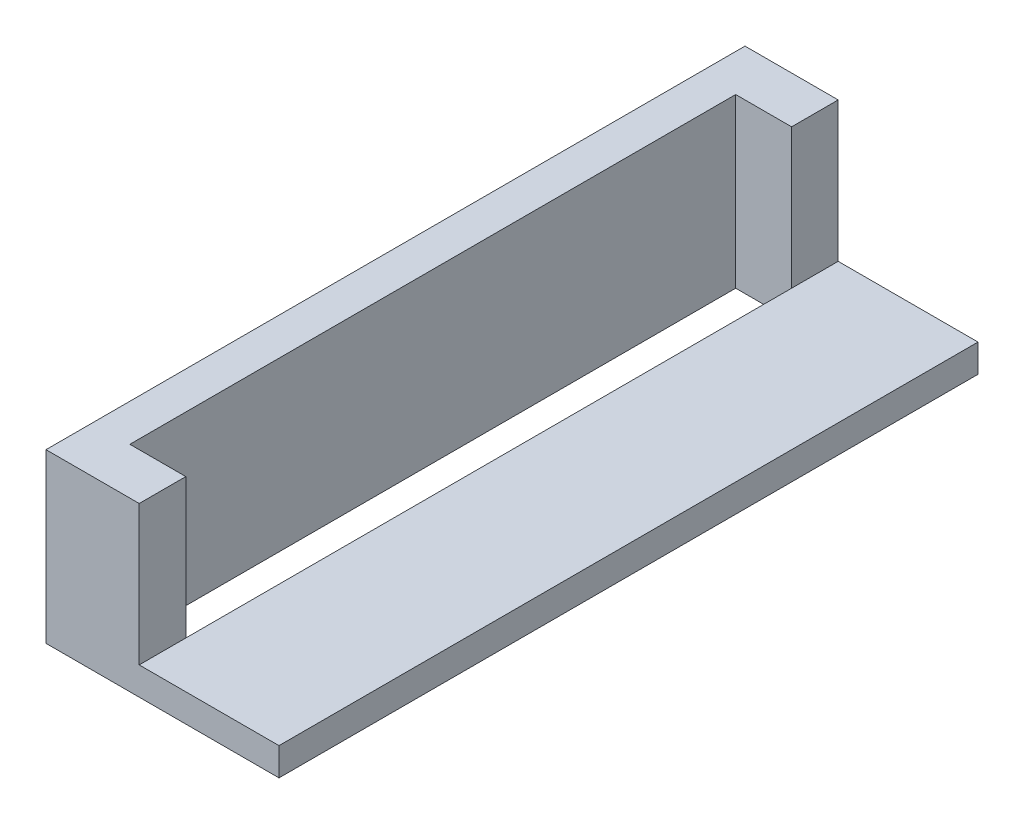
ISO-10303-21;
HEADER;
FILE_DESCRIPTION(('STEP AP214'),'2;1');
FILE_NAME('part.step','',(''),(''),'','','');
FILE_SCHEMA(('AUTOMOTIVE_DESIGN { 1 0 10303 214 1 1 1 1 }'));
ENDSEC;
DATA;
#1=APPLICATION_CONTEXT('core data for automotive mechanical design processes');
#2=APPLICATION_PROTOCOL_DEFINITION('international standard','automotive_design',2000,#1);
#3=PRODUCT_CONTEXT('',#1,'mechanical');
#4=PRODUCT('Part','Part','',(#3));
#5=PRODUCT_RELATED_PRODUCT_CATEGORY('part','',(#4));
#6=PRODUCT_DEFINITION_FORMATION('','',#4);
#7=PRODUCT_DEFINITION_CONTEXT('part definition',#1,'design');
#8=PRODUCT_DEFINITION('design','',#6,#7);
#9=PRODUCT_DEFINITION_SHAPE('','',#8);
#10=(LENGTH_UNIT() NAMED_UNIT(*) SI_UNIT(.MILLI.,.METRE.));
#11=(NAMED_UNIT(*) PLANE_ANGLE_UNIT() SI_UNIT($,.RADIAN.));
#12=(NAMED_UNIT(*) SI_UNIT($,.STERADIAN.) SOLID_ANGLE_UNIT());
#13=UNCERTAINTY_MEASURE_WITH_UNIT(LENGTH_MEASURE(1.E-05),#10,'distance_accuracy_value','');
#14=(GEOMETRIC_REPRESENTATION_CONTEXT(3) GLOBAL_UNCERTAINTY_ASSIGNED_CONTEXT((#13)) GLOBAL_UNIT_ASSIGNED_CONTEXT((#10,
#11,#12)) REPRESENTATION_CONTEXT('',''));
#15=CARTESIAN_POINT('',(0.,0.,0.));
#16=DIRECTION('',(0.,0.,1.));
#17=DIRECTION('',(1.,0.,0.));
#18=AXIS2_PLACEMENT_3D('',#15,#16,#17);
#19=CARTESIAN_POINT('',(-3.,0.6,-15.));
#20=DIRECTION('',(-1.,0.,0.));
#21=DIRECTION('',(0.,0.,1.));
#22=AXIS2_PLACEMENT_3D('',#19,#20,#21);
#23=PLANE('',#22);
#24=DIRECTION('',(0.,0.,1.));
#25=VECTOR('',#24,1.);
#26=CARTESIAN_POINT('',(-3.,0.6,-15.));
#27=LINE('',#26,#25);
#28=CARTESIAN_POINT('',(-3.,0.6,-1.));
#29=VERTEX_POINT('',#28);
#30=CARTESIAN_POINT('',(-3.,0.6,0.));
#31=VERTEX_POINT('',#30);
#32=EDGE_CURVE('E159',#29,#31,#27,.T.);
#33=ORIENTED_EDGE('',*,*,#32,.F.);
#34=DIRECTION('',(0.,1.,0.));
#35=VECTOR('',#34,1.);
#36=CARTESIAN_POINT('',(-3.,0.,-1.));
#37=LINE('',#36,#35);
#38=CARTESIAN_POINT('',(-3.,3.6,-1.));
#39=VERTEX_POINT('',#38);
#40=EDGE_CURVE('E149',#29,#39,#37,.T.);
#41=ORIENTED_EDGE('',*,*,#40,.T.);
#42=DIRECTION('',(0.,0.,1.));
#43=VECTOR('',#42,1.);
#44=CARTESIAN_POINT('',(-3.,3.6,-15.));
#45=LINE('',#44,#43);
#46=CARTESIAN_POINT('',(-3.,3.6,0.));
#47=VERTEX_POINT('',#46);
#48=EDGE_CURVE('E148',#39,#47,#45,.T.);
#49=ORIENTED_EDGE('',*,*,#48,.T.);
#50=DIRECTION('',(0.,1.,0.));
#51=VECTOR('',#50,1.);
#52=CARTESIAN_POINT('',(-3.,0.6,0.));
#53=LINE('',#52,#51);
#54=EDGE_CURVE('E168',#31,#47,#53,.T.);
#55=ORIENTED_EDGE('',*,*,#54,.F.);
#56=EDGE_LOOP('',(#33,#41,#49,#55));
#57=FACE_BOUND('',#56,.T.);
#58=ADVANCED_FACE('F33',(#57),#23,.F.);
#59=CARTESIAN_POINT('',(0.,3.6,0.));
#60=DIRECTION('',(-1.,0.,0.));
#61=DIRECTION('',(0.,0.,1.));
#62=AXIS2_PLACEMENT_3D('',#59,#60,#61);
#63=PLANE('',#62);
#64=DIRECTION('',(0.,-1.,0.));
#65=VECTOR('',#64,1.);
#66=CARTESIAN_POINT('',(0.,3.6,-15.));
#67=LINE('',#66,#65);
#68=CARTESIAN_POINT('',(0.,0.6,-15.));
#69=VERTEX_POINT('',#68);
#70=CARTESIAN_POINT('',(0.,0.,-15.));
#71=VERTEX_POINT('',#70);
#72=EDGE_CURVE('E11',#69,#71,#67,.T.);
#73=ORIENTED_EDGE('',*,*,#72,.F.);
#74=DIRECTION('',(0.,0.,-1.));
#75=VECTOR('',#74,1.);
#76=CARTESIAN_POINT('',(0.,0.6,-15.));
#77=LINE('',#76,#75);
#78=CARTESIAN_POINT('',(0.,0.6,0.));
#79=VERTEX_POINT('',#78);
#80=EDGE_CURVE('E153',#79,#69,#77,.T.);
#81=ORIENTED_EDGE('',*,*,#80,.F.);
#82=DIRECTION('',(0.,-1.,0.));
#83=VECTOR('',#82,1.);
#84=CARTESIAN_POINT('',(0.,3.6,0.));
#85=LINE('',#84,#83);
#86=CARTESIAN_POINT('',(0.,0.,0.));
#87=VERTEX_POINT('',#86);
#88=EDGE_CURVE('E181',#79,#87,#85,.T.);
#89=ORIENTED_EDGE('',*,*,#88,.T.);
#90=DIRECTION('',(0.,0.,-1.));
#91=VECTOR('',#90,1.);
#92=CARTESIAN_POINT('',(0.,0.,0.));
#93=LINE('',#92,#91);
#94=EDGE_CURVE('E171',#87,#71,#93,.T.);
#95=ORIENTED_EDGE('',*,*,#94,.T.);
#96=EDGE_LOOP('',(#73,#81,#89,#95));
#97=FACE_BOUND('',#96,.T.);
#98=ADVANCED_FACE('F35',(#97),#63,.F.);
#99=CARTESIAN_POINT('',(0.,3.6,-15.));
#100=DIRECTION('',(0.,0.,1.));
#101=DIRECTION('',(1.,0.,0.));
#102=AXIS2_PLACEMENT_3D('',#99,#100,#101);
#103=PLANE('',#102);
#104=DIRECTION('',(-1.,0.,0.));
#105=VECTOR('',#104,1.);
#106=CARTESIAN_POINT('',(0.,3.6,-15.));
#107=LINE('',#106,#105);
#108=CARTESIAN_POINT('',(-3.,3.6,-15.));
#109=VERTEX_POINT('',#108);
#110=CARTESIAN_POINT('',(-5.,3.6,-15.));
#111=VERTEX_POINT('',#110);
#112=EDGE_CURVE('E173',#109,#111,#107,.T.);
#113=ORIENTED_EDGE('',*,*,#112,.F.);
#114=DIRECTION('',(0.,1.,0.));
#115=VECTOR('',#114,1.);
#116=CARTESIAN_POINT('',(-3.,0.6,-15.));
#117=LINE('',#116,#115);
#118=CARTESIAN_POINT('',(-3.,0.6,-15.));
#119=VERTEX_POINT('',#118);
#120=EDGE_CURVE('E165',#119,#109,#117,.T.);
#121=ORIENTED_EDGE('',*,*,#120,.F.);
#122=DIRECTION('',(-1.,0.,0.));
#123=VECTOR('',#122,1.);
#124=CARTESIAN_POINT('',(0.,0.6,-15.));
#125=LINE('',#124,#123);
#126=EDGE_CURVE('E155',#69,#119,#125,.T.);
#127=ORIENTED_EDGE('',*,*,#126,.F.);
#128=ORIENTED_EDGE('',*,*,#72,.T.);
#129=DIRECTION('',(-1.,0.,0.));
#130=VECTOR('',#129,1.);
#131=CARTESIAN_POINT('',(0.,0.,-15.));
#132=LINE('',#131,#130);
#133=CARTESIAN_POINT('',(-5.,0.,-15.));
#134=VERTEX_POINT('',#133);
#135=EDGE_CURVE('E184',#71,#134,#132,.T.);
#136=ORIENTED_EDGE('',*,*,#135,.T.);
#137=DIRECTION('',(0.,-1.,0.));
#138=VECTOR('',#137,1.);
#139=CARTESIAN_POINT('',(-5.,3.6,-15.));
#140=LINE('',#139,#138);
#141=EDGE_CURVE('E41',#111,#134,#140,.T.);
#142=ORIENTED_EDGE('',*,*,#141,.F.);
#143=EDGE_LOOP('',(#113,#121,#127,#128,#136,#142));
#144=FACE_BOUND('',#143,.T.);
#145=ADVANCED_FACE('F218',(#144),#103,.F.);
#146=CARTESIAN_POINT('',(-5.,3.6,0.));
#147=DIRECTION('',(1.,0.,0.));
#148=DIRECTION('',(0.,0.,-1.));
#149=AXIS2_PLACEMENT_3D('',#146,#147,#148);
#150=PLANE('',#149);
#151=DIRECTION('',(0.,0.,1.));
#152=VECTOR('',#151,1.);
#153=CARTESIAN_POINT('',(-5.,0.,0.));
#154=LINE('',#153,#152);
#155=CARTESIAN_POINT('',(-5.,0.,0.));
#156=VERTEX_POINT('',#155);
#157=EDGE_CURVE('E186',#134,#156,#154,.T.);
#158=ORIENTED_EDGE('',*,*,#157,.T.);
#159=DIRECTION('',(0.,-1.,0.));
#160=VECTOR('',#159,1.);
#161=CARTESIAN_POINT('',(-5.,3.6,0.));
#162=LINE('',#161,#160);
#163=CARTESIAN_POINT('',(-5.,3.6,0.));
#164=VERTEX_POINT('',#163);
#165=EDGE_CURVE('E191',#164,#156,#162,.T.);
#166=ORIENTED_EDGE('',*,*,#165,.F.);
#167=DIRECTION('',(0.,0.,1.));
#168=VECTOR('',#167,1.);
#169=CARTESIAN_POINT('',(-5.,3.6,0.));
#170=LINE('',#169,#168);
#171=EDGE_CURVE('E175',#111,#164,#170,.T.);
#172=ORIENTED_EDGE('',*,*,#171,.F.);
#173=ORIENTED_EDGE('',*,*,#141,.T.);
#174=EDGE_LOOP('',(#158,#166,#172,#173));
#175=FACE_BOUND('',#174,.T.);
#176=ADVANCED_FACE('F198',(#175),#150,.F.);
#177=CARTESIAN_POINT('',(0.,3.6,0.));
#178=DIRECTION('',(0.,0.,-1.));
#179=DIRECTION('',(-1.,0.,0.));
#180=AXIS2_PLACEMENT_3D('',#177,#178,#179);
#181=PLANE('',#180);
#182=DIRECTION('',(1.,0.,0.));
#183=VECTOR('',#182,1.);
#184=CARTESIAN_POINT('',(0.,0.6,0.));
#185=LINE('',#184,#183);
#186=EDGE_CURVE('E163',#31,#79,#185,.T.);
#187=ORIENTED_EDGE('',*,*,#186,.F.);
#188=ORIENTED_EDGE('',*,*,#54,.T.);
#189=DIRECTION('',(1.,0.,0.));
#190=VECTOR('',#189,1.);
#191=CARTESIAN_POINT('',(0.,3.6,0.));
#192=LINE('',#191,#190);
#193=EDGE_CURVE('E178',#164,#47,#192,.T.);
#194=ORIENTED_EDGE('',*,*,#193,.F.);
#195=ORIENTED_EDGE('',*,*,#165,.T.);
#196=DIRECTION('',(1.,0.,0.));
#197=VECTOR('',#196,1.);
#198=CARTESIAN_POINT('',(0.,0.,0.));
#199=LINE('',#198,#197);
#200=EDGE_CURVE('E176',#156,#87,#199,.T.);
#201=ORIENTED_EDGE('',*,*,#200,.T.);
#202=ORIENTED_EDGE('',*,*,#88,.F.);
#203=EDGE_LOOP('',(#187,#188,#194,#195,#201,#202));
#204=FACE_BOUND('',#203,.T.);
#205=ADVANCED_FACE('F208',(#204),#181,.F.);
#206=CARTESIAN_POINT('',(0.,3.6,0.));
#207=DIRECTION('',(0.,1.,0.));
#208=DIRECTION('',(0.,0.,1.));
#209=AXIS2_PLACEMENT_3D('',#206,#207,#208);
#210=PLANE('',#209);
#211=DIRECTION('',(1.,0.,0.));
#212=VECTOR('',#211,1.);
#213=CARTESIAN_POINT('',(-3.,3.6,-1.));
#214=LINE('',#213,#212);
#215=CARTESIAN_POINT('',(-4.2,3.6,-0.999999999999999));
#216=VERTEX_POINT('',#215);
#217=EDGE_CURVE('E136',#216,#39,#214,.T.);
#218=ORIENTED_EDGE('',*,*,#217,.F.);
#219=DIRECTION('',(0.,0.,1.));
#220=VECTOR('',#219,1.);
#221=CARTESIAN_POINT('',(-4.2,3.6,-14.));
#222=LINE('',#221,#220);
#223=CARTESIAN_POINT('',(-4.2,3.6,-14.));
#224=VERTEX_POINT('',#223);
#225=EDGE_CURVE('E138',#224,#216,#222,.T.);
#226=ORIENTED_EDGE('',*,*,#225,.F.);
#227=DIRECTION('',(-1.,0.,0.));
#228=VECTOR('',#227,1.);
#229=CARTESIAN_POINT('',(-3.,3.6,-14.));
#230=LINE('',#229,#228);
#231=CARTESIAN_POINT('',(-3.,3.6,-14.));
#232=VERTEX_POINT('',#231);
#233=EDGE_CURVE('E143',#232,#224,#230,.T.);
#234=ORIENTED_EDGE('',*,*,#233,.F.);
#235=EDGE_CURVE('E156',#109,#232,#45,.T.);
#236=ORIENTED_EDGE('',*,*,#235,.F.);
#237=ORIENTED_EDGE('',*,*,#112,.T.);
#238=ORIENTED_EDGE('',*,*,#171,.T.);
#239=ORIENTED_EDGE('',*,*,#193,.T.);
#240=ORIENTED_EDGE('',*,*,#48,.F.);
#241=EDGE_LOOP('',(#218,#226,#234,#236,#237,#238,#239,#240));
#242=FACE_BOUND('',#241,.T.);
#243=ADVANCED_FACE('F214',(#242),#210,.T.);
#244=CARTESIAN_POINT('',(0.,0.,0.));
#245=DIRECTION('',(0.,1.,0.));
#246=DIRECTION('',(0.,0.,1.));
#247=AXIS2_PLACEMENT_3D('',#244,#245,#246);
#248=PLANE('',#247);
#249=DIRECTION('',(1.,0.,0.));
#250=VECTOR('',#249,1.);
#251=CARTESIAN_POINT('',(-3.,0.,-1.));
#252=LINE('',#251,#250);
#253=CARTESIAN_POINT('',(-4.2,0.,-0.999999999999999));
#254=VERTEX_POINT('',#253);
#255=CARTESIAN_POINT('',(-3.,0.,-1.));
#256=VERTEX_POINT('',#255);
#257=EDGE_CURVE('E135',#254,#256,#252,.T.);
#258=ORIENTED_EDGE('',*,*,#257,.T.);
#259=DIRECTION('',(0.,0.,-1.));
#260=VECTOR('',#259,1.);
#261=CARTESIAN_POINT('',(-3.,0.,-14.));
#262=LINE('',#261,#260);
#263=CARTESIAN_POINT('',(-3.,0.,-14.));
#264=VERTEX_POINT('',#263);
#265=EDGE_CURVE('E117',#256,#264,#262,.T.);
#266=ORIENTED_EDGE('',*,*,#265,.T.);
#267=DIRECTION('',(-1.,0.,0.));
#268=VECTOR('',#267,1.);
#269=CARTESIAN_POINT('',(-3.,0.,-14.));
#270=LINE('',#269,#268);
#271=CARTESIAN_POINT('',(-4.2,0.,-14.));
#272=VERTEX_POINT('',#271);
#273=EDGE_CURVE('E127',#264,#272,#270,.T.);
#274=ORIENTED_EDGE('',*,*,#273,.T.);
#275=DIRECTION('',(0.,0.,1.));
#276=VECTOR('',#275,1.);
#277=CARTESIAN_POINT('',(-4.2,0.,-14.));
#278=LINE('',#277,#276);
#279=EDGE_CURVE('E48',#272,#254,#278,.T.);
#280=ORIENTED_EDGE('',*,*,#279,.T.);
#281=EDGE_LOOP('',(#258,#266,#274,#280));
#282=FACE_BOUND('',#281,.T.);
#283=ORIENTED_EDGE('',*,*,#94,.F.);
#284=ORIENTED_EDGE('',*,*,#200,.F.);
#285=ORIENTED_EDGE('',*,*,#157,.F.);
#286=ORIENTED_EDGE('',*,*,#135,.F.);
#287=EDGE_LOOP('',(#283,#284,#285,#286));
#288=FACE_BOUND('',#287,.T.);
#289=ADVANCED_FACE('F132',(#282,#288),#248,.F.);
#290=ORIENTED_EDGE('',*,*,#235,.T.);
#291=DIRECTION('',(0.,1.,0.));
#292=VECTOR('',#291,1.);
#293=CARTESIAN_POINT('',(-3.,0.,-14.));
#294=LINE('',#293,#292);
#295=CARTESIAN_POINT('',(-3.,0.6,-14.));
#296=VERTEX_POINT('',#295);
#297=EDGE_CURVE('E124',#296,#232,#294,.T.);
#298=ORIENTED_EDGE('',*,*,#297,.F.);
#299=EDGE_CURVE('E160',#119,#296,#27,.T.);
#300=ORIENTED_EDGE('',*,*,#299,.F.);
#301=ORIENTED_EDGE('',*,*,#120,.T.);
#302=EDGE_LOOP('',(#290,#298,#300,#301));
#303=FACE_BOUND('',#302,.T.);
#304=ADVANCED_FACE('F222',(#303),#23,.F.);
#305=CARTESIAN_POINT('',(0.,0.6,0.));
#306=DIRECTION('',(0.,-1.,0.));
#307=DIRECTION('',(0.,0.,-1.));
#308=AXIS2_PLACEMENT_3D('',#305,#306,#307);
#309=PLANE('',#308);
#310=ORIENTED_EDGE('',*,*,#80,.T.);
#311=ORIENTED_EDGE('',*,*,#126,.T.);
#312=ORIENTED_EDGE('',*,*,#299,.T.);
#313=EDGE_CURVE('E120',#296,#29,#27,.T.);
#314=ORIENTED_EDGE('',*,*,#313,.T.);
#315=ORIENTED_EDGE('',*,*,#32,.T.);
#316=ORIENTED_EDGE('',*,*,#186,.T.);
#317=EDGE_LOOP('',(#310,#311,#312,#314,#315,#316));
#318=FACE_BOUND('',#317,.T.);
#319=ADVANCED_FACE('F224',(#318),#309,.F.);
#320=CARTESIAN_POINT('',(-3.,0.,-14.));
#321=DIRECTION('',(1.,0.,0.));
#322=DIRECTION('',(0.,0.,-1.));
#323=AXIS2_PLACEMENT_3D('',#320,#321,#322);
#324=PLANE('',#323);
#325=EDGE_CURVE('E113',#264,#296,#294,.T.);
#326=ORIENTED_EDGE('',*,*,#325,.F.);
#327=ORIENTED_EDGE('',*,*,#265,.F.);
#328=EDGE_CURVE('E56',#256,#29,#37,.T.);
#329=ORIENTED_EDGE('',*,*,#328,.T.);
#330=ORIENTED_EDGE('',*,*,#313,.F.);
#331=EDGE_LOOP('',(#326,#327,#329,#330));
#332=FACE_BOUND('',#331,.T.);
#333=ADVANCED_FACE('F115',(#332),#324,.F.);
#334=CARTESIAN_POINT('',(-3.,0.,-1.));
#335=DIRECTION('',(0.,0.,1.));
#336=DIRECTION('',(1.,0.,0.));
#337=AXIS2_PLACEMENT_3D('',#334,#335,#336);
#338=PLANE('',#337);
#339=ORIENTED_EDGE('',*,*,#217,.T.);
#340=ORIENTED_EDGE('',*,*,#40,.F.);
#341=ORIENTED_EDGE('',*,*,#328,.F.);
#342=ORIENTED_EDGE('',*,*,#257,.F.);
#343=DIRECTION('',(0.,1.,0.));
#344=VECTOR('',#343,1.);
#345=CARTESIAN_POINT('',(-4.2,0.,-0.999999999999999));
#346=LINE('',#345,#344);
#347=EDGE_CURVE('E150',#254,#216,#346,.T.);
#348=ORIENTED_EDGE('',*,*,#347,.T.);
#349=EDGE_LOOP('',(#339,#340,#341,#342,#348));
#350=FACE_BOUND('',#349,.T.);
#351=ADVANCED_FACE('F289',(#350),#338,.F.);
#352=CARTESIAN_POINT('',(-4.2,0.,-14.));
#353=DIRECTION('',(-1.,0.,0.));
#354=DIRECTION('',(0.,0.,1.));
#355=AXIS2_PLACEMENT_3D('',#352,#353,#354);
#356=PLANE('',#355);
#357=ORIENTED_EDGE('',*,*,#225,.T.);
#358=ORIENTED_EDGE('',*,*,#347,.F.);
#359=ORIENTED_EDGE('',*,*,#279,.F.);
#360=DIRECTION('',(0.,1.,0.));
#361=VECTOR('',#360,1.);
#362=CARTESIAN_POINT('',(-4.2,0.,-14.));
#363=LINE('',#362,#361);
#364=EDGE_CURVE('E123',#272,#224,#363,.T.);
#365=ORIENTED_EDGE('',*,*,#364,.T.);
#366=EDGE_LOOP('',(#357,#358,#359,#365));
#367=FACE_BOUND('',#366,.T.);
#368=ADVANCED_FACE('F298',(#367),#356,.F.);
#369=CARTESIAN_POINT('',(-3.,0.,-14.));
#370=DIRECTION('',(0.,0.,-1.));
#371=DIRECTION('',(-1.,0.,0.));
#372=AXIS2_PLACEMENT_3D('',#369,#370,#371);
#373=PLANE('',#372);
#374=ORIENTED_EDGE('',*,*,#233,.T.);
#375=ORIENTED_EDGE('',*,*,#364,.F.);
#376=ORIENTED_EDGE('',*,*,#273,.F.);
#377=ORIENTED_EDGE('',*,*,#325,.T.);
#378=ORIENTED_EDGE('',*,*,#297,.T.);
#379=EDGE_LOOP('',(#374,#375,#376,#377,#378));
#380=FACE_BOUND('',#379,.T.);
#381=ADVANCED_FACE('F129',(#380),#373,.F.);
#382=CLOSED_SHELL('',(#58,#98,#145,#176,#205,#243,#289,#304,#319,#333,#351,#368,#381));
#383=MANIFOLD_SOLID_BREP('B2',#382);
#384=ADVANCED_BREP_SHAPE_REPRESENTATION('',(#18,#383),#14);
#385=SHAPE_DEFINITION_REPRESENTATION(#9,#384);
ENDSEC;
END-ISO-10303-21;
